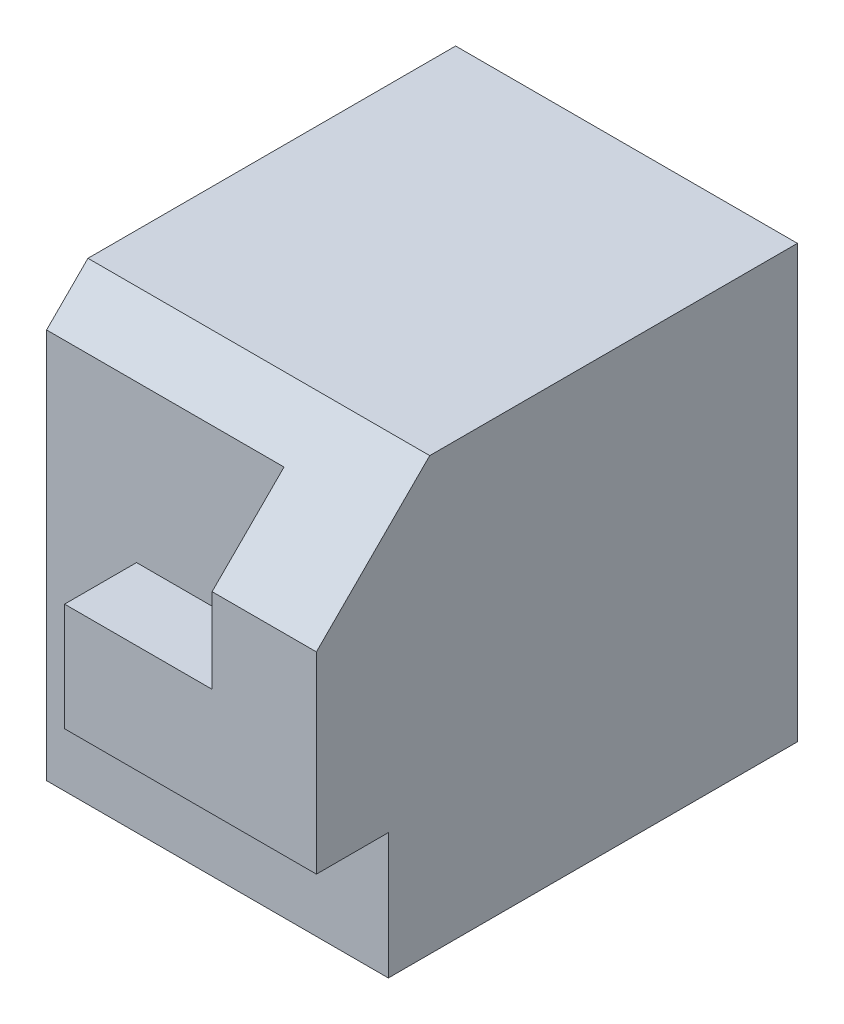
ISO-10303-21;
HEADER;
FILE_DESCRIPTION(('STEP AP214'),'2;1');
FILE_NAME('part.step','',(''),(''),'','','');
FILE_SCHEMA(('AUTOMOTIVE_DESIGN { 1 0 10303 214 1 1 1 1 }'));
ENDSEC;
DATA;
#1=APPLICATION_CONTEXT('core data for automotive mechanical design processes');
#2=APPLICATION_PROTOCOL_DEFINITION('international standard','automotive_design',2000,#1);
#3=PRODUCT_CONTEXT('',#1,'mechanical');
#4=PRODUCT('Part','Part','',(#3));
#5=PRODUCT_RELATED_PRODUCT_CATEGORY('part','',(#4));
#6=PRODUCT_DEFINITION_FORMATION('','',#4);
#7=PRODUCT_DEFINITION_CONTEXT('part definition',#1,'design');
#8=PRODUCT_DEFINITION('design','',#6,#7);
#9=PRODUCT_DEFINITION_SHAPE('','',#8);
#10=(LENGTH_UNIT() NAMED_UNIT(*) SI_UNIT(.MILLI.,.METRE.));
#11=(NAMED_UNIT(*) PLANE_ANGLE_UNIT() SI_UNIT($,.RADIAN.));
#12=(NAMED_UNIT(*) SI_UNIT($,.STERADIAN.) SOLID_ANGLE_UNIT());
#13=UNCERTAINTY_MEASURE_WITH_UNIT(LENGTH_MEASURE(1.E-05),#10,'distance_accuracy_value','');
#14=(GEOMETRIC_REPRESENTATION_CONTEXT(3) GLOBAL_UNCERTAINTY_ASSIGNED_CONTEXT((#13)) GLOBAL_UNIT_ASSIGNED_CONTEXT((#10,
#11,#12)) REPRESENTATION_CONTEXT('',''));
#15=CARTESIAN_POINT('',(0.,0.,0.));
#16=DIRECTION('',(0.,0.,1.));
#17=DIRECTION('',(1.,0.,0.));
#18=AXIS2_PLACEMENT_3D('',#15,#16,#17);
#19=CARTESIAN_POINT('',(-37.3733896389178,2380.09169530355,2674.));
#20=DIRECTION('',(1.,0.,0.));
#21=DIRECTION('',(0.,1.,0.));
#22=AXIS2_PLACEMENT_3D('',#19,#20,#21);
#23=PLANE('',#22);
#24=DIRECTION('',(0.,0.,-1.));
#25=VECTOR('',#24,1.);
#26=CARTESIAN_POINT('',(-37.3733896389175,-19.908304696449,2674.));
#27=LINE('',#26,#25);
#28=CARTESIAN_POINT('',(-37.3733896389175,-19.908304696449,2274.));
#29=VERTEX_POINT('',#28);
#30=CARTESIAN_POINT('',(-37.3733896389175,-19.908304696449,0.));
#31=VERTEX_POINT('',#30);
#32=EDGE_CURVE('E180',#29,#31,#27,.T.);
#33=ORIENTED_EDGE('',*,*,#32,.F.);
#34=DIRECTION('',(0.,-1.,0.));
#35=VECTOR('',#34,1.);
#36=CARTESIAN_POINT('',(-37.3733896389179,2380.09169530355,2274.));
#37=LINE('',#36,#35);
#38=CARTESIAN_POINT('',(-37.3733896389179,2150.09169530355,2274.));
#39=VERTEX_POINT('',#38);
#40=EDGE_CURVE('E137',#39,#29,#37,.T.);
#41=ORIENTED_EDGE('',*,*,#40,.F.);
#42=DIRECTION('',(0.,0.707106781186549,-0.707106781186546));
#43=VECTOR('',#42,1.);
#44=CARTESIAN_POINT('',(-37.3733896389179,1750.09169530355,2674.));
#45=LINE('',#44,#43);
#46=CARTESIAN_POINT('',(-37.3733896389179,2380.09169530355,2044.));
#47=VERTEX_POINT('',#46);
#48=EDGE_CURVE('E154',#39,#47,#45,.T.);
#49=ORIENTED_EDGE('',*,*,#48,.T.);
#50=DIRECTION('',(0.,0.,-1.));
#51=VECTOR('',#50,1.);
#52=CARTESIAN_POINT('',(-37.3733896389178,2380.09169530355,2674.));
#53=LINE('',#52,#51);
#54=CARTESIAN_POINT('',(-37.3733896389178,2380.09169530355,0.));
#55=VERTEX_POINT('',#54);
#56=EDGE_CURVE('E55',#47,#55,#53,.T.);
#57=ORIENTED_EDGE('',*,*,#56,.T.);
#58=DIRECTION('',(0.,-1.,0.));
#59=VECTOR('',#58,1.);
#60=CARTESIAN_POINT('',(-37.3733896389178,2380.09169530355,0.));
#61=LINE('',#60,#59);
#62=EDGE_CURVE('E161',#55,#31,#61,.T.);
#63=ORIENTED_EDGE('',*,*,#62,.T.);
#64=EDGE_LOOP('',(#33,#41,#49,#57,#63));
#65=FACE_BOUND('',#64,.T.);
#66=ADVANCED_FACE('F33',(#65),#23,.F.);
#67=CARTESIAN_POINT('',(-37.3733896389175,-19.908304696449,2674.));
#68=DIRECTION('',(0.,1.,0.));
#69=DIRECTION('',(0.,0.,1.));
#70=AXIS2_PLACEMENT_3D('',#67,#68,#69);
#71=PLANE('',#70);
#72=DIRECTION('',(0.,0.,-1.));
#73=VECTOR('',#72,1.);
#74=CARTESIAN_POINT('',(1862.62661036108,-19.908304696449,2674.));
#75=LINE('',#74,#73);
#76=CARTESIAN_POINT('',(1862.62661036108,-19.908304696449,2274.));
#77=VERTEX_POINT('',#76);
#78=CARTESIAN_POINT('',(1862.62661036108,-19.908304696449,0.));
#79=VERTEX_POINT('',#78);
#80=EDGE_CURVE('E178',#77,#79,#75,.T.);
#81=ORIENTED_EDGE('',*,*,#80,.F.);
#82=DIRECTION('',(1.,0.,0.));
#83=VECTOR('',#82,1.);
#84=CARTESIAN_POINT('',(-37.3733896389175,-19.908304696449,2274.));
#85=LINE('',#84,#83);
#86=EDGE_CURVE('E139',#29,#77,#85,.T.);
#87=ORIENTED_EDGE('',*,*,#86,.F.);
#88=ORIENTED_EDGE('',*,*,#32,.T.);
#89=DIRECTION('',(1.,0.,0.));
#90=VECTOR('',#89,1.);
#91=CARTESIAN_POINT('',(-37.3733896389175,-19.908304696449,0.));
#92=LINE('',#91,#90);
#93=EDGE_CURVE('E168',#31,#79,#92,.T.);
#94=ORIENTED_EDGE('',*,*,#93,.T.);
#95=EDGE_LOOP('',(#81,#87,#88,#94));
#96=FACE_BOUND('',#95,.T.);
#97=ADVANCED_FACE('F194',(#96),#71,.F.);
#98=CARTESIAN_POINT('',(1862.62661036108,2380.09169530355,2674.));
#99=DIRECTION('',(-1.,0.,0.));
#100=DIRECTION('',(0.,-1.,0.));
#101=AXIS2_PLACEMENT_3D('',#98,#99,#100);
#102=PLANE('',#101);
#103=DIRECTION('',(0.,1.,0.));
#104=VECTOR('',#103,1.);
#105=CARTESIAN_POINT('',(1862.62661036108,2380.09169530355,2674.));
#106=LINE('',#105,#104);
#107=CARTESIAN_POINT('',(1862.62661036108,680.091695303551,2674.));
#108=VERTEX_POINT('',#107);
#109=CARTESIAN_POINT('',(1862.62661036108,1750.09169530355,2674.));
#110=VERTEX_POINT('',#109);
#111=EDGE_CURVE('E164',#108,#110,#106,.T.);
#112=ORIENTED_EDGE('',*,*,#111,.F.);
#113=DIRECTION('',(0.,0.,1.));
#114=VECTOR('',#113,1.);
#115=CARTESIAN_POINT('',(1862.62661036108,680.091695303551,2274.));
#116=LINE('',#115,#114);
#117=CARTESIAN_POINT('',(1862.62661036108,680.091695303551,2274.));
#118=VERTEX_POINT('',#117);
#119=EDGE_CURVE('E151',#118,#108,#116,.T.);
#120=ORIENTED_EDGE('',*,*,#119,.F.);
#121=DIRECTION('',(0.,1.,0.));
#122=VECTOR('',#121,1.);
#123=CARTESIAN_POINT('',(1862.62661036108,-19.908304696449,2274.));
#124=LINE('',#123,#122);
#125=EDGE_CURVE('E141',#77,#118,#124,.T.);
#126=ORIENTED_EDGE('',*,*,#125,.F.);
#127=ORIENTED_EDGE('',*,*,#80,.T.);
#128=DIRECTION('',(0.,1.,0.));
#129=VECTOR('',#128,1.);
#130=CARTESIAN_POINT('',(1862.62661036108,2380.09169530355,0.));
#131=LINE('',#130,#129);
#132=CARTESIAN_POINT('',(1862.62661036108,2380.09169530355,0.));
#133=VERTEX_POINT('',#132);
#134=EDGE_CURVE('E171',#79,#133,#131,.T.);
#135=ORIENTED_EDGE('',*,*,#134,.T.);
#136=DIRECTION('',(0.,0.,-1.));
#137=VECTOR('',#136,1.);
#138=CARTESIAN_POINT('',(1862.62661036108,2380.09169530355,2674.));
#139=LINE('',#138,#137);
#140=CARTESIAN_POINT('',(1862.62661036108,2380.09169530355,2044.));
#141=VERTEX_POINT('',#140);
#142=EDGE_CURVE('E176',#141,#133,#139,.T.);
#143=ORIENTED_EDGE('',*,*,#142,.F.);
#144=DIRECTION('',(0.,0.707106781186549,-0.707106781186546));
#145=VECTOR('',#144,1.);
#146=CARTESIAN_POINT('',(1862.62661036108,1750.09169530355,2674.));
#147=LINE('',#146,#145);
#148=EDGE_CURVE('E150',#110,#141,#147,.T.);
#149=ORIENTED_EDGE('',*,*,#148,.F.);
#150=EDGE_LOOP('',(#112,#120,#126,#127,#135,#143,#149));
#151=FACE_BOUND('',#150,.T.);
#152=ADVANCED_FACE('F202',(#151),#102,.F.);
#153=CARTESIAN_POINT('',(-37.3733896389178,2380.09169530355,2674.));
#154=DIRECTION('',(0.,-1.,0.));
#155=DIRECTION('',(0.,0.,-1.));
#156=AXIS2_PLACEMENT_3D('',#153,#154,#155);
#157=PLANE('',#156);
#158=ORIENTED_EDGE('',*,*,#56,.F.);
#159=DIRECTION('',(1.,0.,0.));
#160=VECTOR('',#159,1.);
#161=CARTESIAN_POINT('',(-37.3733896389179,2380.09169530355,2044.));
#162=LINE('',#161,#160);
#163=EDGE_CURVE('E158',#47,#141,#162,.T.);
#164=ORIENTED_EDGE('',*,*,#163,.T.);
#165=ORIENTED_EDGE('',*,*,#142,.T.);
#166=DIRECTION('',(-1.,0.,0.));
#167=VECTOR('',#166,1.);
#168=CARTESIAN_POINT('',(-37.3733896389178,2380.09169530355,0.));
#169=LINE('',#168,#167);
#170=EDGE_CURVE('E166',#133,#55,#169,.T.);
#171=ORIENTED_EDGE('',*,*,#170,.T.);
#172=EDGE_LOOP('',(#158,#164,#165,#171));
#173=FACE_BOUND('',#172,.T.);
#174=ADVANCED_FACE('F231',(#173),#157,.F.);
#175=CARTESIAN_POINT('',(0.,0.,2674.));
#176=DIRECTION('',(0.,0.,1.));
#177=DIRECTION('',(1.,0.,0.));
#178=AXIS2_PLACEMENT_3D('',#175,#176,#177);
#179=PLANE('',#178);
#180=DIRECTION('',(-1.,0.,0.));
#181=VECTOR('',#180,1.);
#182=CARTESIAN_POINT('',(462.626610361083,680.091695303551,2674.));
#183=LINE('',#182,#181);
#184=CARTESIAN_POINT('',(462.626610361083,680.091695303551,2674.));
#185=VERTEX_POINT('',#184);
#186=EDGE_CURVE('E130',#108,#185,#183,.T.);
#187=ORIENTED_EDGE('',*,*,#186,.F.);
#188=ORIENTED_EDGE('',*,*,#111,.T.);
#189=DIRECTION('',(1.,0.,0.));
#190=VECTOR('',#189,1.);
#191=CARTESIAN_POINT('',(-37.3733896389179,1750.09169530355,2674.));
#192=LINE('',#191,#190);
#193=CARTESIAN_POINT('',(1282.62661036108,1750.09169530355,2674.));
#194=VERTEX_POINT('',#193);
#195=EDGE_CURVE('E156',#194,#110,#192,.T.);
#196=ORIENTED_EDGE('',*,*,#195,.F.);
#197=DIRECTION('',(0.,1.,0.));
#198=VECTOR('',#197,1.);
#199=CARTESIAN_POINT('',(1282.62661036108,1280.09169530355,2674.));
#200=LINE('',#199,#198);
#201=CARTESIAN_POINT('',(1282.62661036108,1280.09169530355,2674.));
#202=VERTEX_POINT('',#201);
#203=EDGE_CURVE('E133',#202,#194,#200,.T.);
#204=ORIENTED_EDGE('',*,*,#203,.F.);
#205=DIRECTION('',(1.,0.,0.));
#206=VECTOR('',#205,1.);
#207=CARTESIAN_POINT('',(462.626610361083,1280.09169530355,2674.));
#208=LINE('',#207,#206);
#209=CARTESIAN_POINT('',(462.626610361083,1280.09169530355,2674.));
#210=VERTEX_POINT('',#209);
#211=EDGE_CURVE('E145',#210,#202,#208,.T.);
#212=ORIENTED_EDGE('',*,*,#211,.F.);
#213=DIRECTION('',(0.,1.,0.));
#214=VECTOR('',#213,1.);
#215=CARTESIAN_POINT('',(462.626610361083,680.091695303551,2674.));
#216=LINE('',#215,#214);
#217=EDGE_CURVE('E118',#185,#210,#216,.T.);
#218=ORIENTED_EDGE('',*,*,#217,.F.);
#219=EDGE_LOOP('',(#187,#188,#196,#204,#212,#218));
#220=FACE_BOUND('',#219,.T.);
#221=ADVANCED_FACE('F210',(#220),#179,.T.);
#222=CARTESIAN_POINT('',(0.,0.,0.));
#223=DIRECTION('',(0.,0.,1.));
#224=DIRECTION('',(1.,0.,0.));
#225=AXIS2_PLACEMENT_3D('',#222,#223,#224);
#226=PLANE('',#225);
#227=ORIENTED_EDGE('',*,*,#62,.F.);
#228=ORIENTED_EDGE('',*,*,#170,.F.);
#229=ORIENTED_EDGE('',*,*,#134,.F.);
#230=ORIENTED_EDGE('',*,*,#93,.F.);
#231=EDGE_LOOP('',(#227,#228,#229,#230));
#232=FACE_BOUND('',#231,.T.);
#233=ADVANCED_FACE('F197',(#232),#226,.F.);
#234=CARTESIAN_POINT('',(-37.3733896389179,1750.09169530355,2674.));
#235=DIRECTION('',(0.,-0.707106781186546,-0.707106781186549));
#236=DIRECTION('',(0.,0.707106781186549,-0.707106781186546));
#237=AXIS2_PLACEMENT_3D('',#234,#235,#236);
#238=PLANE('',#237);
#239=DIRECTION('',(1.,0.,0.));
#240=VECTOR('',#239,1.);
#241=CARTESIAN_POINT('',(-37.3733896389179,2150.09169530355,2274.));
#242=LINE('',#241,#240);
#243=CARTESIAN_POINT('',(1282.62661036108,2150.09169530355,2274.));
#244=VERTEX_POINT('',#243);
#245=EDGE_CURVE('E40',#39,#244,#242,.T.);
#246=ORIENTED_EDGE('',*,*,#245,.T.);
#247=DIRECTION('',(0.,-0.707106781186549,0.707106781186546));
#248=VECTOR('',#247,1.);
#249=CARTESIAN_POINT('',(1282.62661036108,1750.09169530355,2674.));
#250=LINE('',#249,#248);
#251=EDGE_CURVE('E11',#244,#194,#250,.T.);
#252=ORIENTED_EDGE('',*,*,#251,.T.);
#253=ORIENTED_EDGE('',*,*,#195,.T.);
#254=ORIENTED_EDGE('',*,*,#148,.T.);
#255=ORIENTED_EDGE('',*,*,#163,.F.);
#256=ORIENTED_EDGE('',*,*,#48,.F.);
#257=EDGE_LOOP('',(#246,#252,#253,#254,#255,#256));
#258=FACE_BOUND('',#257,.T.);
#259=ADVANCED_FACE('F184',(#258),#238,.F.);
#260=CARTESIAN_POINT('',(1282.62661036108,1280.09169530355,2274.));
#261=DIRECTION('',(1.,0.,0.));
#262=DIRECTION('',(0.,0.,-1.));
#263=AXIS2_PLACEMENT_3D('',#260,#261,#262);
#264=PLANE('',#263);
#265=DIRECTION('',(0.,1.,0.));
#266=VECTOR('',#265,1.);
#267=CARTESIAN_POINT('',(1282.62661036108,1280.09169530355,2274.));
#268=LINE('',#267,#266);
#269=CARTESIAN_POINT('',(1282.62661036108,1280.09169530355,2274.));
#270=VERTEX_POINT('',#269);
#271=EDGE_CURVE('E47',#270,#244,#268,.T.);
#272=ORIENTED_EDGE('',*,*,#271,.F.);
#273=DIRECTION('',(0.,0.,1.));
#274=VECTOR('',#273,1.);
#275=CARTESIAN_POINT('',(1282.62661036108,1280.09169530355,2274.));
#276=LINE('',#275,#274);
#277=EDGE_CURVE('E122',#270,#202,#276,.T.);
#278=ORIENTED_EDGE('',*,*,#277,.T.);
#279=ORIENTED_EDGE('',*,*,#203,.T.);
#280=ORIENTED_EDGE('',*,*,#251,.F.);
#281=EDGE_LOOP('',(#272,#278,#279,#280));
#282=FACE_BOUND('',#281,.T.);
#283=ADVANCED_FACE('F213',(#282),#264,.F.);
#284=CARTESIAN_POINT('',(0.,0.,2274.));
#285=DIRECTION('',(0.,0.,-1.));
#286=DIRECTION('',(-1.,0.,0.));
#287=AXIS2_PLACEMENT_3D('',#284,#285,#286);
#288=PLANE('',#287);
#289=ORIENTED_EDGE('',*,*,#40,.T.);
#290=ORIENTED_EDGE('',*,*,#86,.T.);
#291=ORIENTED_EDGE('',*,*,#125,.T.);
#292=DIRECTION('',(-1.,0.,0.));
#293=VECTOR('',#292,1.);
#294=CARTESIAN_POINT('',(462.626610361083,680.091695303551,2274.));
#295=LINE('',#294,#293);
#296=CARTESIAN_POINT('',(462.626610361083,680.091695303551,2274.));
#297=VERTEX_POINT('',#296);
#298=EDGE_CURVE('E123',#118,#297,#295,.T.);
#299=ORIENTED_EDGE('',*,*,#298,.T.);
#300=DIRECTION('',(0.,1.,0.));
#301=VECTOR('',#300,1.);
#302=CARTESIAN_POINT('',(462.626610361083,680.091695303551,2274.));
#303=LINE('',#302,#301);
#304=CARTESIAN_POINT('',(462.626610361083,1280.09169530355,2274.));
#305=VERTEX_POINT('',#304);
#306=EDGE_CURVE('E115',#297,#305,#303,.T.);
#307=ORIENTED_EDGE('',*,*,#306,.T.);
#308=DIRECTION('',(1.,0.,0.));
#309=VECTOR('',#308,1.);
#310=CARTESIAN_POINT('',(462.626610361083,1280.09169530355,2274.));
#311=LINE('',#310,#309);
#312=EDGE_CURVE('E125',#305,#270,#311,.T.);
#313=ORIENTED_EDGE('',*,*,#312,.T.);
#314=ORIENTED_EDGE('',*,*,#271,.T.);
#315=ORIENTED_EDGE('',*,*,#245,.F.);
#316=EDGE_LOOP('',(#289,#290,#291,#299,#307,#313,#314,#315));
#317=FACE_BOUND('',#316,.T.);
#318=ADVANCED_FACE('F128',(#317),#288,.F.);
#319=CARTESIAN_POINT('',(462.626610361083,680.091695303551,2274.));
#320=DIRECTION('',(1.,0.,0.));
#321=DIRECTION('',(0.,0.,-1.));
#322=AXIS2_PLACEMENT_3D('',#319,#320,#321);
#323=PLANE('',#322);
#324=ORIENTED_EDGE('',*,*,#217,.T.);
#325=DIRECTION('',(0.,0.,1.));
#326=VECTOR('',#325,1.);
#327=CARTESIAN_POINT('',(462.626610361083,1280.09169530355,2274.));
#328=LINE('',#327,#326);
#329=EDGE_CURVE('E111',#305,#210,#328,.T.);
#330=ORIENTED_EDGE('',*,*,#329,.F.);
#331=ORIENTED_EDGE('',*,*,#306,.F.);
#332=DIRECTION('',(0.,0.,1.));
#333=VECTOR('',#332,1.);
#334=CARTESIAN_POINT('',(462.626610361083,680.091695303551,2274.));
#335=LINE('',#334,#333);
#336=EDGE_CURVE('E148',#297,#185,#335,.T.);
#337=ORIENTED_EDGE('',*,*,#336,.T.);
#338=EDGE_LOOP('',(#324,#330,#331,#337));
#339=FACE_BOUND('',#338,.T.);
#340=ADVANCED_FACE('F113',(#339),#323,.F.);
#341=CARTESIAN_POINT('',(462.626610361083,680.091695303551,2274.));
#342=DIRECTION('',(0.,1.,0.));
#343=DIRECTION('',(0.,0.,1.));
#344=AXIS2_PLACEMENT_3D('',#341,#342,#343);
#345=PLANE('',#344);
#346=ORIENTED_EDGE('',*,*,#186,.T.);
#347=ORIENTED_EDGE('',*,*,#336,.F.);
#348=ORIENTED_EDGE('',*,*,#298,.F.);
#349=ORIENTED_EDGE('',*,*,#119,.T.);
#350=EDGE_LOOP('',(#346,#347,#348,#349));
#351=FACE_BOUND('',#350,.T.);
#352=ADVANCED_FACE('F207',(#351),#345,.F.);
#353=CARTESIAN_POINT('',(462.626610361083,1280.09169530355,2274.));
#354=DIRECTION('',(0.,-1.,0.));
#355=DIRECTION('',(0.,0.,-1.));
#356=AXIS2_PLACEMENT_3D('',#353,#354,#355);
#357=PLANE('',#356);
#358=ORIENTED_EDGE('',*,*,#211,.T.);
#359=ORIENTED_EDGE('',*,*,#277,.F.);
#360=ORIENTED_EDGE('',*,*,#312,.F.);
#361=ORIENTED_EDGE('',*,*,#329,.T.);
#362=EDGE_LOOP('',(#358,#359,#360,#361));
#363=FACE_BOUND('',#362,.T.);
#364=ADVANCED_FACE('F126',(#363),#357,.F.);
#365=CLOSED_SHELL('',(#66,#97,#152,#174,#221,#233,#259,#283,#318,#340,#352,#364));
#366=MANIFOLD_SOLID_BREP('B2',#365);
#367=ADVANCED_BREP_SHAPE_REPRESENTATION('',(#18,#366),#14);
#368=SHAPE_DEFINITION_REPRESENTATION(#9,#367);
ENDSEC;
END-ISO-10303-21;
